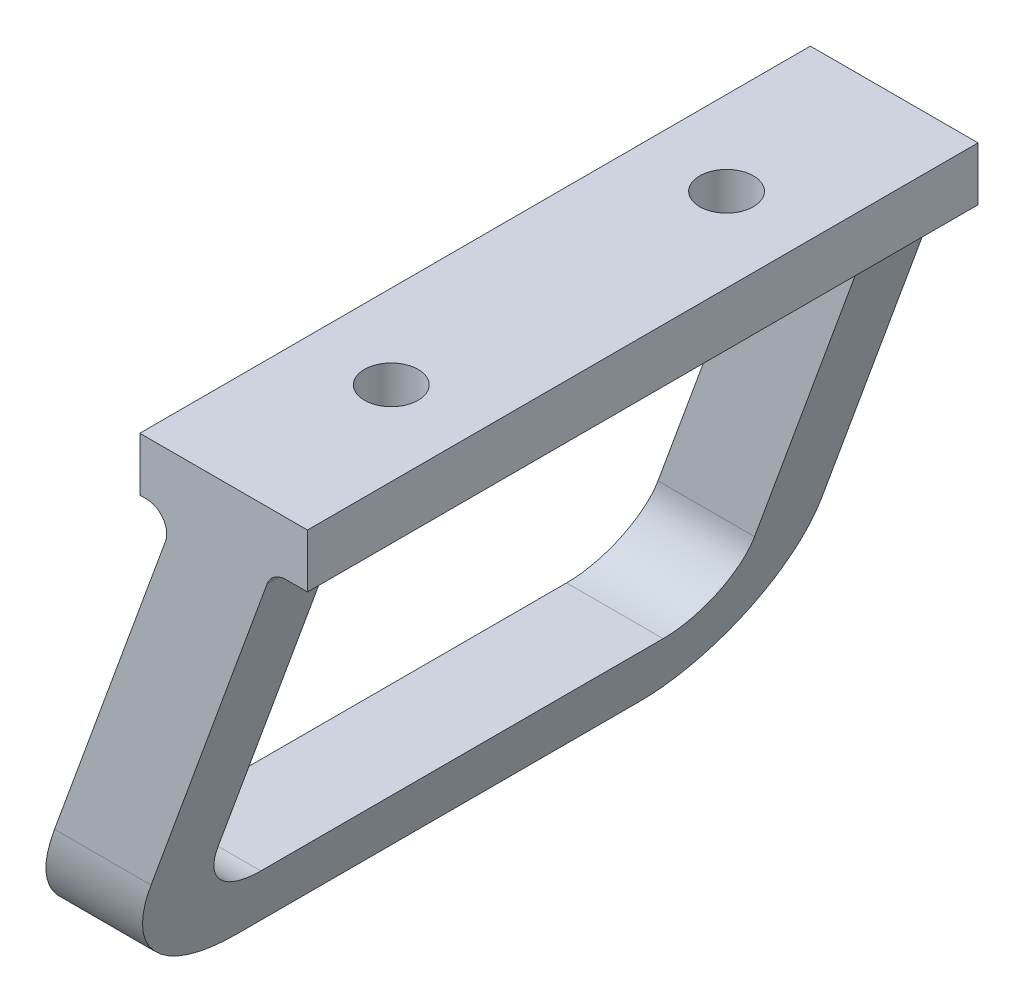
ISO-10303-21;
HEADER;
FILE_DESCRIPTION(('STEP AP214'),'2;1');
FILE_NAME('part.step','',(''),(''),'','','');
FILE_SCHEMA(('AUTOMOTIVE_DESIGN { 1 0 10303 214 1 1 1 1 }'));
ENDSEC;
DATA;
#1=APPLICATION_CONTEXT('core data for automotive mechanical design processes');
#2=APPLICATION_PROTOCOL_DEFINITION('international standard','automotive_design',2000,#1);
#3=PRODUCT_CONTEXT('',#1,'mechanical');
#4=PRODUCT('Part','Part','',(#3));
#5=PRODUCT_RELATED_PRODUCT_CATEGORY('part','',(#4));
#6=PRODUCT_DEFINITION_FORMATION('','',#4);
#7=PRODUCT_DEFINITION_CONTEXT('part definition',#1,'design');
#8=PRODUCT_DEFINITION('design','',#6,#7);
#9=PRODUCT_DEFINITION_SHAPE('','',#8);
#10=(LENGTH_UNIT() NAMED_UNIT(*) SI_UNIT(.MILLI.,.METRE.));
#11=(NAMED_UNIT(*) PLANE_ANGLE_UNIT() SI_UNIT($,.RADIAN.));
#12=(NAMED_UNIT(*) SI_UNIT($,.STERADIAN.) SOLID_ANGLE_UNIT());
#13=UNCERTAINTY_MEASURE_WITH_UNIT(LENGTH_MEASURE(1.E-05),#10,'distance_accuracy_value','');
#14=(GEOMETRIC_REPRESENTATION_CONTEXT(3) GLOBAL_UNCERTAINTY_ASSIGNED_CONTEXT((#13)) GLOBAL_UNIT_ASSIGNED_CONTEXT((#10,
#11,#12)) REPRESENTATION_CONTEXT('',''));
#15=CARTESIAN_POINT('',(0.,0.,0.));
#16=DIRECTION('',(0.,0.,1.));
#17=DIRECTION('',(1.,0.,0.));
#18=AXIS2_PLACEMENT_3D('',#15,#16,#17);
#19=CARTESIAN_POINT('',(-18.1,-69.5111787122018,50.));
#20=DIRECTION('',(0.,1.,0.));
#21=DIRECTION('',(0.,0.,1.));
#22=AXIS2_PLACEMENT_3D('',#19,#20,#21);
#23=PLANE('',#22);
#24=DIRECTION('',(0.,0.,-1.));
#25=VECTOR('',#24,1.);
#26=CARTESIAN_POINT('',(-18.1,-69.5111787122018,50.));
#27=LINE('',#26,#25);
#28=CARTESIAN_POINT('',(-18.1,-69.5111787122018,30.));
#29=VERTEX_POINT('',#28);
#30=CARTESIAN_POINT('',(-18.1,-69.5111787122018,-30.));
#31=VERTEX_POINT('',#30);
#32=EDGE_CURVE('E188',#29,#31,#27,.T.);
#33=ORIENTED_EDGE('',*,*,#32,.F.);
#34=DIRECTION('',(1.,0.,0.));
#35=VECTOR('',#34,1.);
#36=CARTESIAN_POINT('',(-32.5,-69.5111787122018,30.));
#37=LINE('',#36,#35);
#38=CARTESIAN_POINT('',(-32.5,-69.5111787122018,30.));
#39=VERTEX_POINT('',#38);
#40=EDGE_CURVE('E173',#39,#29,#37,.T.);
#41=ORIENTED_EDGE('',*,*,#40,.F.);
#42=DIRECTION('',(0.,0.,-1.));
#43=VECTOR('',#42,1.);
#44=CARTESIAN_POINT('',(-32.5,-69.5111787122018,50.));
#45=LINE('',#44,#43);
#46=CARTESIAN_POINT('',(-32.5,-69.5111787122018,-30.));
#47=VERTEX_POINT('',#46);
#48=EDGE_CURVE('E180',#39,#47,#45,.T.);
#49=ORIENTED_EDGE('',*,*,#48,.T.);
#50=DIRECTION('',(1.,0.,0.));
#51=VECTOR('',#50,1.);
#52=CARTESIAN_POINT('',(-32.5,-69.5111787122018,-30.));
#53=LINE('',#52,#51);
#54=EDGE_CURVE('E162',#47,#31,#53,.T.);
#55=ORIENTED_EDGE('',*,*,#54,.T.);
#56=EDGE_LOOP('',(#33,#41,#49,#55));
#57=FACE_BOUND('',#56,.T.);
#58=ADVANCED_FACE('F39',(#57),#23,.F.);
#59=CARTESIAN_POINT('',(-12.5,0.,50.));
#60=DIRECTION('',(1.,0.,0.));
#61=DIRECTION('',(0.,0.,-1.));
#62=AXIS2_PLACEMENT_3D('',#59,#60,#61);
#63=PLANE('',#62);
#64=DIRECTION('',(0.,-1.,0.));
#65=VECTOR('',#64,1.);
#66=CARTESIAN_POINT('',(-12.5,0.,-50.));
#67=LINE('',#66,#65);
#68=CARTESIAN_POINT('',(-12.5,8.,-50.));
#69=VERTEX_POINT('',#68);
#70=CARTESIAN_POINT('',(-12.5,0.,-50.));
#71=VERTEX_POINT('',#70);
#72=EDGE_CURVE('E265',#69,#71,#67,.T.);
#73=ORIENTED_EDGE('',*,*,#72,.T.);
#74=DIRECTION('',(0.,0.,-1.));
#75=VECTOR('',#74,1.);
#76=CARTESIAN_POINT('',(-12.5,0.,50.));
#77=LINE('',#76,#75);
#78=CARTESIAN_POINT('',(-12.5,0.,50.));
#79=VERTEX_POINT('',#78);
#80=EDGE_CURVE('E198',#79,#71,#77,.T.);
#81=ORIENTED_EDGE('',*,*,#80,.F.);
#82=DIRECTION('',(0.,-1.,0.));
#83=VECTOR('',#82,1.);
#84=CARTESIAN_POINT('',(-12.5,0.,50.));
#85=LINE('',#84,#83);
#86=CARTESIAN_POINT('',(-12.5,8.,50.));
#87=VERTEX_POINT('',#86);
#88=EDGE_CURVE('E266',#87,#79,#85,.T.);
#89=ORIENTED_EDGE('',*,*,#88,.F.);
#90=DIRECTION('',(0.,0.,-1.));
#91=VECTOR('',#90,1.);
#92=CARTESIAN_POINT('',(-12.5,8.,50.));
#93=LINE('',#92,#91);
#94=EDGE_CURVE('E287',#87,#69,#93,.T.);
#95=ORIENTED_EDGE('',*,*,#94,.T.);
#96=EDGE_LOOP('',(#73,#81,#89,#95));
#97=FACE_BOUND('',#96,.T.);
#98=ADVANCED_FACE('F41',(#97),#63,.F.);
#99=CARTESIAN_POINT('',(-11.4844440202264,0.,50.));
#100=DIRECTION('',(0.,1.,0.));
#101=DIRECTION('',(-1.,0.,0.));
#102=AXIS2_PLACEMENT_3D('',#99,#100,#101);
#103=PLANE('',#102);
#104=DIRECTION('',(1.,0.,0.));
#105=VECTOR('',#104,1.);
#106=CARTESIAN_POINT('',(-11.4844440202264,0.,-50.));
#107=LINE('',#106,#105);
#108=CARTESIAN_POINT('',(-11.4844440202264,0.,-50.));
#109=VERTEX_POINT('',#108);
#110=EDGE_CURVE('E290',#71,#109,#107,.T.);
#111=ORIENTED_EDGE('',*,*,#110,.T.);
#112=DIRECTION('',(0.,0.,-1.));
#113=VECTOR('',#112,1.);
#114=CARTESIAN_POINT('',(-11.4844440202264,0.,50.));
#115=LINE('',#114,#113);
#116=CARTESIAN_POINT('',(-11.4844440202264,0.,50.));
#117=VERTEX_POINT('',#116);
#118=EDGE_CURVE('E190',#117,#109,#115,.T.);
#119=ORIENTED_EDGE('',*,*,#118,.F.);
#120=DIRECTION('',(1.,0.,0.));
#121=VECTOR('',#120,1.);
#122=CARTESIAN_POINT('',(-11.4844440202264,0.,50.));
#123=LINE('',#122,#121);
#124=EDGE_CURVE('E269',#79,#117,#123,.T.);
#125=ORIENTED_EDGE('',*,*,#124,.F.);
#126=ORIENTED_EDGE('',*,*,#80,.T.);
#127=EDGE_LOOP('',(#111,#119,#125,#126));
#128=FACE_BOUND('',#127,.T.);
#129=ADVANCED_FACE('F386',(#128),#103,.F.);
#130=CARTESIAN_POINT('',(-11.4844440202263,-3.,50.));
#131=DIRECTION('',(0.,0.,-1.));
#132=DIRECTION('',(-1.,0.,0.));
#133=AXIS2_PLACEMENT_3D('',#130,#131,#132);
#134=CYLINDRICAL_SURFACE('',#133,3.);
#135=CARTESIAN_POINT('',(-11.4844440202263,-3.,-50.));
#136=DIRECTION('',(0.,0.,-1.));
#137=DIRECTION('',(-1.,0.,0.));
#138=AXIS2_PLACEMENT_3D('',#135,#136,#137);
#139=CIRCLE('',#138,3.);
#140=CARTESIAN_POINT('',(-8.66536615786863,-4.02606042997703,-50.));
#141=VERTEX_POINT('',#140);
#142=EDGE_CURVE('E292',#109,#141,#139,.T.);
#143=ORIENTED_EDGE('',*,*,#142,.T.);
#144=DIRECTION('',(0.,0.,-1.));
#145=VECTOR('',#144,1.);
#146=CARTESIAN_POINT('',(-8.66536615786863,-4.02606042997703,50.));
#147=LINE('',#146,#145);
#148=CARTESIAN_POINT('',(-8.66536615786863,-4.02606042997703,50.));
#149=VERTEX_POINT('',#148);
#150=EDGE_CURVE('E187',#149,#141,#147,.T.);
#151=ORIENTED_EDGE('',*,*,#150,.F.);
#152=CARTESIAN_POINT('',(-11.4844440202263,-3.,50.));
#153=DIRECTION('',(0.,0.,-1.));
#154=DIRECTION('',(-1.,0.,0.));
#155=AXIS2_PLACEMENT_3D('',#152,#153,#154);
#156=CIRCLE('',#155,3.);
#157=EDGE_CURVE('E272',#117,#149,#156,.T.);
#158=ORIENTED_EDGE('',*,*,#157,.F.);
#159=ORIENTED_EDGE('',*,*,#118,.T.);
#160=EDGE_LOOP('',(#143,#151,#158,#159));
#161=FACE_BOUND('',#160,.T.);
#162=ADVANCED_FACE('F391',(#161),#134,.F.);
#163=CARTESIAN_POINT('',(-32.5,-69.5111787122018,50.));
#164=DIRECTION('',(0.939692620785908,-0.342020143325669,0.));
#165=DIRECTION('',(0.342020143325669,0.939692620785908,0.));
#166=AXIS2_PLACEMENT_3D('',#163,#164,#165);
#167=PLANE('',#166);
#168=CARTESIAN_POINT('',(-25.2205953146759,-49.5111787122018,-30.));
#169=DIRECTION('',(0.939692620785908,-0.342020143325669,0.));
#170=DIRECTION('',(0.342020143325669,0.939692620785908,0.));
#171=AXIS2_PLACEMENT_3D('',#168,#169,#170);
#172=ELLIPSE('',#171,10.6417777247591,10.);
#173=CARTESIAN_POINT('',(-28.860297657338,-59.5111787122018,-30.));
#174=VERTEX_POINT('',#173);
#175=CARTESIAN_POINT('',(-25.2205953146759,-49.5111787122018,-40.));
#176=VERTEX_POINT('',#175);
#177=EDGE_CURVE('E262',#174,#176,#172,.T.);
#178=ORIENTED_EDGE('',*,*,#177,.T.);
#179=DIRECTION('',(0.342020143325669,0.939692620785908,0.));
#180=VECTOR('',#179,1.);
#181=CARTESIAN_POINT('',(-32.5,-69.5111787122019,-40.));
#182=LINE('',#181,#180);
#183=CARTESIAN_POINT('',(-9.74779163986342,-7.00000000000001,-40.));
#184=VERTEX_POINT('',#183);
#185=EDGE_CURVE('E232',#176,#184,#182,.T.);
#186=ORIENTED_EDGE('',*,*,#185,.T.);
#187=DIRECTION('',(0.,0.,1.));
#188=VECTOR('',#187,1.);
#189=CARTESIAN_POINT('',(-9.74779163986342,-7.00000000000001,50.));
#190=LINE('',#189,#188);
#191=CARTESIAN_POINT('',(-9.74779163986342,-7.00000000000001,40.));
#192=VERTEX_POINT('',#191);
#193=EDGE_CURVE('E250',#184,#192,#190,.T.);
#194=ORIENTED_EDGE('',*,*,#193,.T.);
#195=DIRECTION('',(-0.342020143325669,-0.939692620785908,0.));
#196=VECTOR('',#195,1.);
#197=CARTESIAN_POINT('',(-32.5,-69.5111787122018,40.));
#198=LINE('',#197,#196);
#199=CARTESIAN_POINT('',(-25.2205953146759,-49.5111787122018,40.));
#200=VERTEX_POINT('',#199);
#201=EDGE_CURVE('E253',#192,#200,#198,.T.);
#202=ORIENTED_EDGE('',*,*,#201,.T.);
#203=CARTESIAN_POINT('',(-25.2205953146759,-49.5111787122018,30.));
#204=DIRECTION('',(0.939692620785908,-0.342020143325669,0.));
#205=DIRECTION('',(0.342020143325669,0.939692620785908,0.));
#206=AXIS2_PLACEMENT_3D('',#203,#204,#205);
#207=ELLIPSE('',#206,10.6417777247591,10.);
#208=CARTESIAN_POINT('',(-28.860297657338,-59.5111787122018,30.));
#209=VERTEX_POINT('',#208);
#210=EDGE_CURVE('E256',#200,#209,#207,.T.);
#211=ORIENTED_EDGE('',*,*,#210,.T.);
#212=DIRECTION('',(0.,0.,-1.));
#213=VECTOR('',#212,1.);
#214=CARTESIAN_POINT('',(-28.860297657338,-59.5111787122018,50.));
#215=LINE('',#214,#213);
#216=EDGE_CURVE('E259',#209,#174,#215,.T.);
#217=ORIENTED_EDGE('',*,*,#216,.T.);
#218=EDGE_LOOP('',(#178,#186,#194,#202,#211,#217));
#219=FACE_BOUND('',#218,.T.);
#220=ORIENTED_EDGE('',*,*,#48,.F.);
#221=CARTESIAN_POINT('',(-25.2205953146759,-49.5111787122018,30.));
#222=DIRECTION('',(0.939692620785908,-0.342020143325669,0.));
#223=DIRECTION('',(0.342020143325669,0.939692620785908,0.));
#224=AXIS2_PLACEMENT_3D('',#221,#222,#223);
#225=ELLIPSE('',#224,21.2835554495182,20.);
#226=CARTESIAN_POINT('',(-25.2205953146759,-49.5111787122018,50.));
#227=VERTEX_POINT('',#226);
#228=EDGE_CURVE('E248',#39,#227,#225,.F.);
#229=ORIENTED_EDGE('',*,*,#228,.T.);
#230=DIRECTION('',(-0.342020143325669,-0.939692620785908,0.));
#231=VECTOR('',#230,1.);
#232=CARTESIAN_POINT('',(-32.5,-69.5111787122018,50.));
#233=LINE('',#232,#231);
#234=EDGE_CURVE('E274',#149,#227,#233,.T.);
#235=ORIENTED_EDGE('',*,*,#234,.F.);
#236=ORIENTED_EDGE('',*,*,#150,.T.);
#237=DIRECTION('',(-0.342020143325669,-0.939692620785908,0.));
#238=VECTOR('',#237,1.);
#239=CARTESIAN_POINT('',(-32.5,-69.5111787122018,-50.));
#240=LINE('',#239,#238);
#241=CARTESIAN_POINT('',(-25.2205953146759,-49.5111787122018,-50.));
#242=VERTEX_POINT('',#241);
#243=EDGE_CURVE('E183',#141,#242,#240,.T.);
#244=ORIENTED_EDGE('',*,*,#243,.T.);
#245=CARTESIAN_POINT('',(-25.2205953146759,-49.5111787122018,-30.));
#246=DIRECTION('',(0.939692620785908,-0.342020143325669,0.));
#247=DIRECTION('',(0.342020143325669,0.939692620785908,0.));
#248=AXIS2_PLACEMENT_3D('',#245,#246,#247);
#249=ELLIPSE('',#248,21.2835554495182,20.);
#250=EDGE_CURVE('E165',#242,#47,#249,.F.);
#251=ORIENTED_EDGE('',*,*,#250,.T.);
#252=EDGE_LOOP('',(#220,#229,#235,#236,#244,#251));
#253=FACE_BOUND('',#252,.T.);
#254=ADVANCED_FACE('F178',(#219,#253),#167,.F.);
#255=CARTESIAN_POINT('',(6.4815447522714,-1.97393957002301,50.));
#256=DIRECTION('',(-0.939692620785908,0.342020143325669,0.));
#257=DIRECTION('',(-0.342020143325669,-0.939692620785908,0.));
#258=AXIS2_PLACEMENT_3D('',#255,#256,#257);
#259=PLANE('',#258);
#260=DIRECTION('',(0.,0.,-1.));
#261=VECTOR('',#260,1.);
#262=CARTESIAN_POINT('',(4.65220836013657,-7.00000000000001,50.));
#263=LINE('',#262,#261);
#264=CARTESIAN_POINT('',(4.65220836013657,-7.00000000000001,40.));
#265=VERTEX_POINT('',#264);
#266=CARTESIAN_POINT('',(4.65220836013657,-7.00000000000001,-40.));
#267=VERTEX_POINT('',#266);
#268=EDGE_CURVE('E205',#265,#267,#263,.T.);
#269=ORIENTED_EDGE('',*,*,#268,.T.);
#270=DIRECTION('',(-0.342020143325669,-0.939692620785908,0.));
#271=VECTOR('',#270,1.);
#272=CARTESIAN_POINT('',(6.48154475227139,-1.97393957002303,-40.));
#273=LINE('',#272,#271);
#274=CARTESIAN_POINT('',(-10.820595314676,-49.5111787122018,-40.));
#275=VERTEX_POINT('',#274);
#276=EDGE_CURVE('E11',#267,#275,#273,.T.);
#277=ORIENTED_EDGE('',*,*,#276,.T.);
#278=CARTESIAN_POINT('',(-10.820595314676,-49.5111787122018,-30.));
#279=DIRECTION('',(-0.939692620785908,0.342020143325669,0.));
#280=DIRECTION('',(0.342020143325669,0.939692620785908,0.));
#281=AXIS2_PLACEMENT_3D('',#278,#279,#280);
#282=ELLIPSE('',#281,10.6417777247591,10.);
#283=CARTESIAN_POINT('',(-14.460297657338,-59.5111787122018,-30.));
#284=VERTEX_POINT('',#283);
#285=EDGE_CURVE('E47',#275,#284,#282,.T.);
#286=ORIENTED_EDGE('',*,*,#285,.T.);
#287=DIRECTION('',(0.,0.,1.));
#288=VECTOR('',#287,1.);
#289=CARTESIAN_POINT('',(-14.460297657338,-59.5111787122018,50.));
#290=LINE('',#289,#288);
#291=CARTESIAN_POINT('',(-14.460297657338,-59.5111787122018,30.));
#292=VERTEX_POINT('',#291);
#293=EDGE_CURVE('E214',#284,#292,#290,.T.);
#294=ORIENTED_EDGE('',*,*,#293,.T.);
#295=CARTESIAN_POINT('',(-10.820595314676,-49.5111787122018,30.));
#296=DIRECTION('',(-0.939692620785908,0.342020143325669,0.));
#297=DIRECTION('',(0.342020143325669,0.939692620785908,0.));
#298=AXIS2_PLACEMENT_3D('',#295,#296,#297);
#299=ELLIPSE('',#298,10.6417777247591,10.);
#300=CARTESIAN_POINT('',(-10.820595314676,-49.5111787122018,40.));
#301=VERTEX_POINT('',#300);
#302=EDGE_CURVE('E211',#292,#301,#299,.T.);
#303=ORIENTED_EDGE('',*,*,#302,.T.);
#304=DIRECTION('',(0.342020143325669,0.939692620785908,0.));
#305=VECTOR('',#304,1.);
#306=CARTESIAN_POINT('',(6.4815447522714,-1.973939570023,40.));
#307=LINE('',#306,#305);
#308=EDGE_CURVE('E208',#301,#265,#307,.T.);
#309=ORIENTED_EDGE('',*,*,#308,.T.);
#310=EDGE_LOOP('',(#269,#277,#286,#294,#303,#309));
#311=FACE_BOUND('',#310,.T.);
#312=DIRECTION('',(0.342020143325669,0.939692620785908,0.));
#313=VECTOR('',#312,1.);
#314=CARTESIAN_POINT('',(6.4815447522714,-1.97393957002301,50.));
#315=LINE('',#314,#313);
#316=CARTESIAN_POINT('',(-10.8205953146759,-49.5111787122018,50.));
#317=VERTEX_POINT('',#316);
#318=CARTESIAN_POINT('',(6.4815447522714,-1.97393957002301,50.));
#319=VERTEX_POINT('',#318);
#320=EDGE_CURVE('E277',#317,#319,#315,.T.);
#321=ORIENTED_EDGE('',*,*,#320,.F.);
#322=CARTESIAN_POINT('',(-10.820595314676,-49.5111787122018,30.));
#323=DIRECTION('',(-0.939692620785908,0.342020143325669,0.));
#324=DIRECTION('',(0.342020143325669,0.939692620785908,0.));
#325=AXIS2_PLACEMENT_3D('',#322,#323,#324);
#326=ELLIPSE('',#325,21.2835554495182,20.);
#327=EDGE_CURVE('E184',#317,#29,#326,.F.);
#328=ORIENTED_EDGE('',*,*,#327,.T.);
#329=ORIENTED_EDGE('',*,*,#32,.T.);
#330=CARTESIAN_POINT('',(-10.820595314676,-49.5111787122018,-30.));
#331=DIRECTION('',(-0.939692620785908,0.342020143325669,0.));
#332=DIRECTION('',(0.342020143325669,0.939692620785908,0.));
#333=AXIS2_PLACEMENT_3D('',#330,#331,#332);
#334=ELLIPSE('',#333,21.2835554495182,20.);
#335=CARTESIAN_POINT('',(-10.8205953146759,-49.5111787122018,-50.));
#336=VERTEX_POINT('',#335);
#337=EDGE_CURVE('E168',#31,#336,#334,.F.);
#338=ORIENTED_EDGE('',*,*,#337,.T.);
#339=DIRECTION('',(0.342020143325669,0.939692620785908,0.));
#340=VECTOR('',#339,1.);
#341=CARTESIAN_POINT('',(6.4815447522714,-1.97393957002301,-50.));
#342=LINE('',#341,#340);
#343=CARTESIAN_POINT('',(6.4815447522714,-1.97393957002301,-50.));
#344=VERTEX_POINT('',#343);
#345=EDGE_CURVE('E295',#336,#344,#342,.T.);
#346=ORIENTED_EDGE('',*,*,#345,.T.);
#347=DIRECTION('',(0.,0.,-1.));
#348=VECTOR('',#347,1.);
#349=CARTESIAN_POINT('',(6.4815447522714,-1.97393957002301,50.));
#350=LINE('',#349,#348);
#351=EDGE_CURVE('E192',#319,#344,#350,.T.);
#352=ORIENTED_EDGE('',*,*,#351,.F.);
#353=EDGE_LOOP('',(#321,#328,#329,#338,#346,#352));
#354=FACE_BOUND('',#353,.T.);
#355=ADVANCED_FACE('F218',(#311,#354),#259,.F.);
#356=CARTESIAN_POINT('',(9.30062261462913,-3.,50.));
#357=DIRECTION('',(0.,0.,-1.));
#358=DIRECTION('',(-1.,0.,0.));
#359=AXIS2_PLACEMENT_3D('',#356,#357,#358);
#360=CYLINDRICAL_SURFACE('',#359,3.);
#361=CARTESIAN_POINT('',(9.30062261462913,-3.,-50.));
#362=DIRECTION('',(0.,0.,-1.));
#363=DIRECTION('',(1.,0.,0.));
#364=AXIS2_PLACEMENT_3D('',#361,#362,#363);
#365=CIRCLE('',#364,3.);
#366=CARTESIAN_POINT('',(9.30062261462914,0.,-50.));
#367=VERTEX_POINT('',#366);
#368=EDGE_CURVE('E297',#344,#367,#365,.T.);
#369=ORIENTED_EDGE('',*,*,#368,.T.);
#370=DIRECTION('',(0.,0.,-1.));
#371=VECTOR('',#370,1.);
#372=CARTESIAN_POINT('',(9.30062261462914,0.,50.));
#373=LINE('',#372,#371);
#374=CARTESIAN_POINT('',(9.30062261462914,0.,50.));
#375=VERTEX_POINT('',#374);
#376=EDGE_CURVE('E312',#375,#367,#373,.T.);
#377=ORIENTED_EDGE('',*,*,#376,.F.);
#378=CARTESIAN_POINT('',(9.30062261462913,-3.,50.));
#379=DIRECTION('',(0.,0.,-1.));
#380=DIRECTION('',(1.,0.,0.));
#381=AXIS2_PLACEMENT_3D('',#378,#379,#380);
#382=CIRCLE('',#381,3.);
#383=EDGE_CURVE('E279',#319,#375,#382,.T.);
#384=ORIENTED_EDGE('',*,*,#383,.F.);
#385=ORIENTED_EDGE('',*,*,#351,.T.);
#386=EDGE_LOOP('',(#369,#377,#384,#385));
#387=FACE_BOUND('',#386,.T.);
#388=ADVANCED_FACE('F319',(#387),#360,.F.);
#389=CARTESIAN_POINT('',(12.5,0.,50.));
#390=DIRECTION('',(0.,1.,0.));
#391=DIRECTION('',(-1.,0.,0.));
#392=AXIS2_PLACEMENT_3D('',#389,#390,#391);
#393=PLANE('',#392);
#394=DIRECTION('',(1.,0.,0.));
#395=VECTOR('',#394,1.);
#396=CARTESIAN_POINT('',(12.5,0.,-50.));
#397=LINE('',#396,#395);
#398=CARTESIAN_POINT('',(12.5,0.,-50.));
#399=VERTEX_POINT('',#398);
#400=EDGE_CURVE('E299',#367,#399,#397,.T.);
#401=ORIENTED_EDGE('',*,*,#400,.T.);
#402=DIRECTION('',(0.,0.,-1.));
#403=VECTOR('',#402,1.);
#404=CARTESIAN_POINT('',(12.5,0.,50.));
#405=LINE('',#404,#403);
#406=CARTESIAN_POINT('',(12.5,0.,50.));
#407=VERTEX_POINT('',#406);
#408=EDGE_CURVE('E309',#407,#399,#405,.T.);
#409=ORIENTED_EDGE('',*,*,#408,.F.);
#410=DIRECTION('',(1.,0.,0.));
#411=VECTOR('',#410,1.);
#412=CARTESIAN_POINT('',(12.5,0.,50.));
#413=LINE('',#412,#411);
#414=EDGE_CURVE('E281',#375,#407,#413,.T.);
#415=ORIENTED_EDGE('',*,*,#414,.F.);
#416=ORIENTED_EDGE('',*,*,#376,.T.);
#417=EDGE_LOOP('',(#401,#409,#415,#416));
#418=FACE_BOUND('',#417,.T.);
#419=ADVANCED_FACE('F330',(#418),#393,.F.);
#420=CARTESIAN_POINT('',(12.5,8.,50.));
#421=DIRECTION('',(-1.,0.,0.));
#422=DIRECTION('',(0.,-1.,0.));
#423=AXIS2_PLACEMENT_3D('',#420,#421,#422);
#424=PLANE('',#423);
#425=DIRECTION('',(0.,1.,0.));
#426=VECTOR('',#425,1.);
#427=CARTESIAN_POINT('',(12.5,8.,-50.));
#428=LINE('',#427,#426);
#429=CARTESIAN_POINT('',(12.5,8.,-50.));
#430=VERTEX_POINT('',#429);
#431=EDGE_CURVE('E301',#399,#430,#428,.T.);
#432=ORIENTED_EDGE('',*,*,#431,.T.);
#433=DIRECTION('',(0.,0.,-1.));
#434=VECTOR('',#433,1.);
#435=CARTESIAN_POINT('',(12.5,8.,50.));
#436=LINE('',#435,#434);
#437=CARTESIAN_POINT('',(12.5,8.,50.));
#438=VERTEX_POINT('',#437);
#439=EDGE_CURVE('E306',#438,#430,#436,.T.);
#440=ORIENTED_EDGE('',*,*,#439,.F.);
#441=DIRECTION('',(0.,1.,0.));
#442=VECTOR('',#441,1.);
#443=CARTESIAN_POINT('',(12.5,8.,50.));
#444=LINE('',#443,#442);
#445=EDGE_CURVE('E283',#407,#438,#444,.T.);
#446=ORIENTED_EDGE('',*,*,#445,.F.);
#447=ORIENTED_EDGE('',*,*,#408,.T.);
#448=EDGE_LOOP('',(#432,#440,#446,#447));
#449=FACE_BOUND('',#448,.T.);
#450=ADVANCED_FACE('F334',(#449),#424,.F.);
#451=CARTESIAN_POINT('',(-12.5,8.,50.));
#452=DIRECTION('',(0.,-1.,0.));
#453=DIRECTION('',(1.,0.,0.));
#454=AXIS2_PLACEMENT_3D('',#451,#452,#453);
#455=PLANE('',#454);
#456=CARTESIAN_POINT('',(0.,8.,25.));
#457=DIRECTION('',(0.,-1.,0.));
#458=DIRECTION('',(1.,0.,0.));
#459=AXIS2_PLACEMENT_3D('',#456,#457,#458);
#460=CIRCLE('',#459,4.);
#461=CARTESIAN_POINT('',(4.,8.,25.));
#462=VERTEX_POINT('',#461);
#463=EDGE_CURVE('E343',#462,#462,#460,.T.);
#464=ORIENTED_EDGE('',*,*,#463,.T.);
#465=EDGE_LOOP('',(#464));
#466=FACE_BOUND('',#465,.T.);
#467=CARTESIAN_POINT('',(0.,8.,-25.));
#468=DIRECTION('',(0.,-1.,0.));
#469=DIRECTION('',(1.,0.,0.));
#470=AXIS2_PLACEMENT_3D('',#467,#468,#469);
#471=CIRCLE('',#470,4.);
#472=CARTESIAN_POINT('',(4.,8.,-25.));
#473=VERTEX_POINT('',#472);
#474=EDGE_CURVE('E345',#473,#473,#471,.T.);
#475=ORIENTED_EDGE('',*,*,#474,.T.);
#476=EDGE_LOOP('',(#475));
#477=FACE_BOUND('',#476,.T.);
#478=DIRECTION('',(-1.,0.,0.));
#479=VECTOR('',#478,1.);
#480=CARTESIAN_POINT('',(-12.5,8.,-50.));
#481=LINE('',#480,#479);
#482=EDGE_CURVE('E270',#430,#69,#481,.T.);
#483=ORIENTED_EDGE('',*,*,#482,.T.);
#484=ORIENTED_EDGE('',*,*,#94,.F.);
#485=DIRECTION('',(-1.,0.,0.));
#486=VECTOR('',#485,1.);
#487=CARTESIAN_POINT('',(-12.5,8.,50.));
#488=LINE('',#487,#486);
#489=EDGE_CURVE('E285',#438,#87,#488,.T.);
#490=ORIENTED_EDGE('',*,*,#489,.F.);
#491=ORIENTED_EDGE('',*,*,#439,.T.);
#492=EDGE_LOOP('',(#483,#484,#490,#491));
#493=FACE_BOUND('',#492,.T.);
#494=ADVANCED_FACE('F375',(#466,#477,#493),#455,.F.);
#495=CARTESIAN_POINT('',(9.30062261462913,-3.,50.));
#496=DIRECTION('',(0.,0.,1.));
#497=DIRECTION('',(1.,0.,0.));
#498=AXIS2_PLACEMENT_3D('',#495,#496,#497);
#499=PLANE('',#498);
#500=DIRECTION('',(1.,0.,0.));
#501=VECTOR('',#500,1.);
#502=CARTESIAN_POINT('',(-32.5,-49.5111787122018,50.));
#503=LINE('',#502,#501);
#504=EDGE_CURVE('E203',#317,#227,#503,.F.);
#505=ORIENTED_EDGE('',*,*,#504,.F.);
#506=ORIENTED_EDGE('',*,*,#320,.T.);
#507=ORIENTED_EDGE('',*,*,#383,.T.);
#508=ORIENTED_EDGE('',*,*,#414,.T.);
#509=ORIENTED_EDGE('',*,*,#445,.T.);
#510=ORIENTED_EDGE('',*,*,#489,.T.);
#511=ORIENTED_EDGE('',*,*,#88,.T.);
#512=ORIENTED_EDGE('',*,*,#124,.T.);
#513=ORIENTED_EDGE('',*,*,#157,.T.);
#514=ORIENTED_EDGE('',*,*,#234,.T.);
#515=EDGE_LOOP('',(#505,#506,#507,#508,#509,#510,#511,#512,#513,#514));
#516=FACE_BOUND('',#515,.T.);
#517=ADVANCED_FACE('F339',(#516),#499,.T.);
#518=CARTESIAN_POINT('',(9.30062261462913,-3.,-50.));
#519=DIRECTION('',(0.,0.,1.));
#520=DIRECTION('',(1.,0.,0.));
#521=AXIS2_PLACEMENT_3D('',#518,#519,#520);
#522=PLANE('',#521);
#523=ORIENTED_EDGE('',*,*,#345,.F.);
#524=DIRECTION('',(1.,0.,0.));
#525=VECTOR('',#524,1.);
#526=CARTESIAN_POINT('',(-32.5,-49.5111787122018,-50.));
#527=LINE('',#526,#525);
#528=EDGE_CURVE('E201',#336,#242,#527,.F.);
#529=ORIENTED_EDGE('',*,*,#528,.T.);
#530=ORIENTED_EDGE('',*,*,#243,.F.);
#531=ORIENTED_EDGE('',*,*,#142,.F.);
#532=ORIENTED_EDGE('',*,*,#110,.F.);
#533=ORIENTED_EDGE('',*,*,#72,.F.);
#534=ORIENTED_EDGE('',*,*,#482,.F.);
#535=ORIENTED_EDGE('',*,*,#431,.F.);
#536=ORIENTED_EDGE('',*,*,#400,.F.);
#537=ORIENTED_EDGE('',*,*,#368,.F.);
#538=EDGE_LOOP('',(#523,#529,#530,#531,#532,#533,#534,#535,#536,#537));
#539=FACE_BOUND('',#538,.T.);
#540=ADVANCED_FACE('F325',(#539),#522,.F.);
#541=CARTESIAN_POINT('',(-32.5,-49.5111787122018,-30.));
#542=DIRECTION('',(1.,0.,0.));
#543=DIRECTION('',(0.,0.,-1.));
#544=AXIS2_PLACEMENT_3D('',#541,#542,#543);
#545=CYLINDRICAL_SURFACE('',#544,20.);
#546=ORIENTED_EDGE('',*,*,#528,.F.);
#547=ORIENTED_EDGE('',*,*,#337,.F.);
#548=ORIENTED_EDGE('',*,*,#54,.F.);
#549=ORIENTED_EDGE('',*,*,#250,.F.);
#550=EDGE_LOOP('',(#546,#547,#548,#549));
#551=FACE_BOUND('',#550,.T.);
#552=ADVANCED_FACE('F164',(#551),#545,.T.);
#553=CARTESIAN_POINT('',(-32.5,-49.5111787122018,30.));
#554=DIRECTION('',(1.,0.,0.));
#555=DIRECTION('',(0.,0.,-1.));
#556=AXIS2_PLACEMENT_3D('',#553,#554,#555);
#557=CYLINDRICAL_SURFACE('',#556,20.);
#558=ORIENTED_EDGE('',*,*,#40,.T.);
#559=ORIENTED_EDGE('',*,*,#327,.F.);
#560=ORIENTED_EDGE('',*,*,#504,.T.);
#561=ORIENTED_EDGE('',*,*,#228,.F.);
#562=EDGE_LOOP('',(#558,#559,#560,#561));
#563=FACE_BOUND('',#562,.T.);
#564=ADVANCED_FACE('F342',(#563),#557,.T.);
#565=CARTESIAN_POINT('',(-32.5,-49.5111787122018,-40.));
#566=DIRECTION('',(0.,0.,-1.));
#567=DIRECTION('',(0.,1.,0.));
#568=AXIS2_PLACEMENT_3D('',#565,#566,#567);
#569=PLANE('',#568);
#570=DIRECTION('',(1.,0.,0.));
#571=VECTOR('',#570,1.);
#572=CARTESIAN_POINT('',(-32.5,-49.5111787122018,-40.));
#573=LINE('',#572,#571);
#574=EDGE_CURVE('E225',#176,#275,#573,.T.);
#575=ORIENTED_EDGE('',*,*,#574,.T.);
#576=ORIENTED_EDGE('',*,*,#276,.F.);
#577=DIRECTION('',(1.,0.,0.));
#578=VECTOR('',#577,1.);
#579=CARTESIAN_POINT('',(-32.5,-7.00000000000001,-40.));
#580=LINE('',#579,#578);
#581=EDGE_CURVE('E59',#184,#267,#580,.T.);
#582=ORIENTED_EDGE('',*,*,#581,.F.);
#583=ORIENTED_EDGE('',*,*,#185,.F.);
#584=EDGE_LOOP('',(#575,#576,#582,#583));
#585=FACE_BOUND('',#584,.T.);
#586=ADVANCED_FACE('F230',(#585),#569,.F.);
#587=CARTESIAN_POINT('',(-32.5,-49.5111787122018,-30.));
#588=DIRECTION('',(1.,0.,0.));
#589=DIRECTION('',(0.,0.,-1.));
#590=AXIS2_PLACEMENT_3D('',#587,#588,#589);
#591=CYLINDRICAL_SURFACE('',#590,10.);
#592=DIRECTION('',(1.,0.,0.));
#593=VECTOR('',#592,1.);
#594=CARTESIAN_POINT('',(-32.5,-59.5111787122018,-30.));
#595=LINE('',#594,#593);
#596=EDGE_CURVE('E228',#174,#284,#595,.T.);
#597=ORIENTED_EDGE('',*,*,#596,.T.);
#598=ORIENTED_EDGE('',*,*,#285,.F.);
#599=ORIENTED_EDGE('',*,*,#574,.F.);
#600=ORIENTED_EDGE('',*,*,#177,.F.);
#601=EDGE_LOOP('',(#597,#598,#599,#600));
#602=FACE_BOUND('',#601,.T.);
#603=ADVANCED_FACE('F224',(#602),#591,.F.);
#604=CARTESIAN_POINT('',(-32.5,-59.5111787122018,30.));
#605=DIRECTION('',(0.,-1.,0.));
#606=DIRECTION('',(0.,0.,-1.));
#607=AXIS2_PLACEMENT_3D('',#604,#605,#606);
#608=PLANE('',#607);
#609=DIRECTION('',(1.,0.,0.));
#610=VECTOR('',#609,1.);
#611=CARTESIAN_POINT('',(-32.5,-59.5111787122018,30.));
#612=LINE('',#611,#610);
#613=EDGE_CURVE('E235',#209,#292,#612,.T.);
#614=ORIENTED_EDGE('',*,*,#613,.T.);
#615=ORIENTED_EDGE('',*,*,#293,.F.);
#616=ORIENTED_EDGE('',*,*,#596,.F.);
#617=ORIENTED_EDGE('',*,*,#216,.F.);
#618=EDGE_LOOP('',(#614,#615,#616,#617));
#619=FACE_BOUND('',#618,.T.);
#620=ADVANCED_FACE('F426',(#619),#608,.F.);
#621=CARTESIAN_POINT('',(-32.5,-49.5111787122018,30.));
#622=DIRECTION('',(1.,0.,0.));
#623=DIRECTION('',(0.,0.,-1.));
#624=AXIS2_PLACEMENT_3D('',#621,#622,#623);
#625=CYLINDRICAL_SURFACE('',#624,10.);
#626=DIRECTION('',(1.,0.,0.));
#627=VECTOR('',#626,1.);
#628=CARTESIAN_POINT('',(-32.5,-49.5111787122018,40.));
#629=LINE('',#628,#627);
#630=EDGE_CURVE('E241',#200,#301,#629,.T.);
#631=ORIENTED_EDGE('',*,*,#630,.T.);
#632=ORIENTED_EDGE('',*,*,#302,.F.);
#633=ORIENTED_EDGE('',*,*,#613,.F.);
#634=ORIENTED_EDGE('',*,*,#210,.F.);
#635=EDGE_LOOP('',(#631,#632,#633,#634));
#636=FACE_BOUND('',#635,.T.);
#637=ADVANCED_FACE('F422',(#636),#625,.F.);
#638=CARTESIAN_POINT('',(-32.5,-7.00000000000001,40.));
#639=DIRECTION('',(0.,0.,1.));
#640=DIRECTION('',(0.,-1.,0.));
#641=AXIS2_PLACEMENT_3D('',#638,#639,#640);
#642=PLANE('',#641);
#643=DIRECTION('',(1.,0.,0.));
#644=VECTOR('',#643,1.);
#645=CARTESIAN_POINT('',(-32.5,-7.00000000000001,40.));
#646=LINE('',#645,#644);
#647=EDGE_CURVE('E54',#192,#265,#646,.T.);
#648=ORIENTED_EDGE('',*,*,#647,.T.);
#649=ORIENTED_EDGE('',*,*,#308,.F.);
#650=ORIENTED_EDGE('',*,*,#630,.F.);
#651=ORIENTED_EDGE('',*,*,#201,.F.);
#652=EDGE_LOOP('',(#648,#649,#650,#651));
#653=FACE_BOUND('',#652,.T.);
#654=ADVANCED_FACE('F366',(#653),#642,.F.);
#655=CARTESIAN_POINT('',(-32.5,-7.00000000000001,-40.));
#656=DIRECTION('',(0.,1.,0.));
#657=DIRECTION('',(0.,0.,1.));
#658=AXIS2_PLACEMENT_3D('',#655,#656,#657);
#659=PLANE('',#658);
#660=CARTESIAN_POINT('',(0.,-7.00000000000001,25.));
#661=DIRECTION('',(0.,1.,0.));
#662=DIRECTION('',(0.,0.,1.));
#663=AXIS2_PLACEMENT_3D('',#660,#661,#662);
#664=CIRCLE('',#663,4.);
#665=CARTESIAN_POINT('',(0.,-7.00000000000001,29.));
#666=VERTEX_POINT('',#665);
#667=EDGE_CURVE('E350',#666,#666,#664,.F.);
#668=ORIENTED_EDGE('',*,*,#667,.F.);
#669=EDGE_LOOP('',(#668));
#670=FACE_BOUND('',#669,.T.);
#671=CARTESIAN_POINT('',(0.,-7.00000000000001,-25.));
#672=DIRECTION('',(0.,1.,0.));
#673=DIRECTION('',(0.,0.,1.));
#674=AXIS2_PLACEMENT_3D('',#671,#672,#673);
#675=CIRCLE('',#674,4.);
#676=CARTESIAN_POINT('',(0.,-7.00000000000001,-21.));
#677=VERTEX_POINT('',#676);
#678=EDGE_CURVE('E353',#677,#677,#675,.F.);
#679=ORIENTED_EDGE('',*,*,#678,.F.);
#680=EDGE_LOOP('',(#679));
#681=FACE_BOUND('',#680,.T.);
#682=ORIENTED_EDGE('',*,*,#581,.T.);
#683=ORIENTED_EDGE('',*,*,#268,.F.);
#684=ORIENTED_EDGE('',*,*,#647,.F.);
#685=ORIENTED_EDGE('',*,*,#193,.F.);
#686=EDGE_LOOP('',(#682,#683,#684,#685));
#687=FACE_BOUND('',#686,.T.);
#688=ADVANCED_FACE('F362',(#670,#681,#687),#659,.F.);
#689=CARTESIAN_POINT('',(0.,-18.3137084989848,-25.));
#690=DIRECTION('',(0.,1.,0.));
#691=DIRECTION('',(-1.,0.,0.));
#692=AXIS2_PLACEMENT_3D('',#689,#690,#691);
#693=CYLINDRICAL_SURFACE('',#692,4.);
#694=ORIENTED_EDGE('',*,*,#678,.T.);
#695=EDGE_LOOP('',(#694));
#696=FACE_BOUND('',#695,.T.);
#697=ORIENTED_EDGE('',*,*,#474,.F.);
#698=EDGE_LOOP('',(#697));
#699=FACE_BOUND('',#698,.T.);
#700=ADVANCED_FACE('F365',(#696,#699),#693,.F.);
#701=CARTESIAN_POINT('',(0.,-18.3137084989848,25.));
#702=DIRECTION('',(0.,1.,0.));
#703=DIRECTION('',(-1.,0.,0.));
#704=AXIS2_PLACEMENT_3D('',#701,#702,#703);
#705=CYLINDRICAL_SURFACE('',#704,4.);
#706=ORIENTED_EDGE('',*,*,#667,.T.);
#707=EDGE_LOOP('',(#706));
#708=FACE_BOUND('',#707,.T.);
#709=ORIENTED_EDGE('',*,*,#463,.F.);
#710=EDGE_LOOP('',(#709));
#711=FACE_BOUND('',#710,.T.);
#712=ADVANCED_FACE('F359',(#708,#711),#705,.F.);
#713=CLOSED_SHELL('',(#58,#98,#129,#162,#254,#355,#388,#419,#450,#494,#517,#540,#552,#564,#586,
#603,#620,#637,#654,#688,#700,#712));
#714=MANIFOLD_SOLID_BREP('B2',#713);
#715=ADVANCED_BREP_SHAPE_REPRESENTATION('',(#18,#714),#14);
#716=SHAPE_DEFINITION_REPRESENTATION(#9,#715);
ENDSEC;
END-ISO-10303-21;
